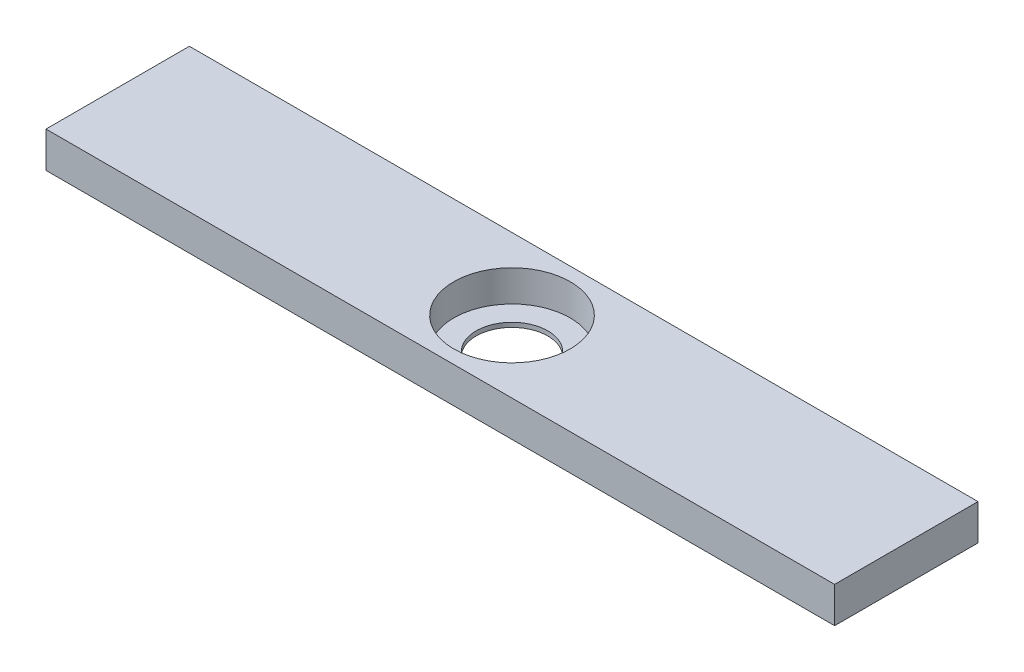
ISO-10303-21;
HEADER;
FILE_DESCRIPTION(('STEP AP214'),'2;1');
FILE_NAME('part.step','',(''),(''),'','','');
FILE_SCHEMA(('AUTOMOTIVE_DESIGN { 1 0 10303 214 1 1 1 1 }'));
ENDSEC;
DATA;
#1=APPLICATION_CONTEXT('core data for automotive mechanical design processes');
#2=APPLICATION_PROTOCOL_DEFINITION('international standard','automotive_design',2000,#1);
#3=PRODUCT_CONTEXT('',#1,'mechanical');
#4=PRODUCT('Part','Part','',(#3));
#5=PRODUCT_RELATED_PRODUCT_CATEGORY('part','',(#4));
#6=PRODUCT_DEFINITION_FORMATION('','',#4);
#7=PRODUCT_DEFINITION_CONTEXT('part definition',#1,'design');
#8=PRODUCT_DEFINITION('design','',#6,#7);
#9=PRODUCT_DEFINITION_SHAPE('','',#8);
#10=(LENGTH_UNIT() NAMED_UNIT(*) SI_UNIT(.MILLI.,.METRE.));
#11=(NAMED_UNIT(*) PLANE_ANGLE_UNIT() SI_UNIT($,.RADIAN.));
#12=(NAMED_UNIT(*) SI_UNIT($,.STERADIAN.) SOLID_ANGLE_UNIT());
#13=UNCERTAINTY_MEASURE_WITH_UNIT(LENGTH_MEASURE(1.E-05),#10,'distance_accuracy_value','');
#14=(GEOMETRIC_REPRESENTATION_CONTEXT(3) GLOBAL_UNCERTAINTY_ASSIGNED_CONTEXT((#13)) GLOBAL_UNIT_ASSIGNED_CONTEXT((#10,
#11,#12)) REPRESENTATION_CONTEXT('',''));
#15=CARTESIAN_POINT('',(0.,0.,0.));
#16=DIRECTION('',(0.,0.,1.));
#17=DIRECTION('',(1.,0.,0.));
#18=AXIS2_PLACEMENT_3D('',#15,#16,#17);
#19=CARTESIAN_POINT('',(139.7,12.7,-25.4));
#20=DIRECTION('',(-1.,0.,0.));
#21=DIRECTION('',(0.,0.,1.));
#22=AXIS2_PLACEMENT_3D('',#19,#20,#21);
#23=PLANE('',#22);
#24=DIRECTION('',(0.,0.,-1.));
#25=VECTOR('',#24,1.);
#26=CARTESIAN_POINT('',(139.7,0.,-25.4));
#27=LINE('',#26,#25);
#28=CARTESIAN_POINT('',(139.7,0.,25.4));
#29=VERTEX_POINT('',#28);
#30=CARTESIAN_POINT('',(139.7,0.,-25.4));
#31=VERTEX_POINT('',#30);
#32=EDGE_CURVE('E94',#29,#31,#27,.T.);
#33=ORIENTED_EDGE('',*,*,#32,.T.);
#34=DIRECTION('',(0.,-1.,0.));
#35=VECTOR('',#34,1.);
#36=CARTESIAN_POINT('',(139.7,12.7,-25.4));
#37=LINE('',#36,#35);
#38=CARTESIAN_POINT('',(139.7,12.7,-25.4));
#39=VERTEX_POINT('',#38);
#40=EDGE_CURVE('E11',#39,#31,#37,.T.);
#41=ORIENTED_EDGE('',*,*,#40,.F.);
#42=DIRECTION('',(0.,0.,-1.));
#43=VECTOR('',#42,1.);
#44=CARTESIAN_POINT('',(139.7,12.7,-25.4));
#45=LINE('',#44,#43);
#46=CARTESIAN_POINT('',(139.7,12.7,25.4));
#47=VERTEX_POINT('',#46);
#48=EDGE_CURVE('E82',#47,#39,#45,.T.);
#49=ORIENTED_EDGE('',*,*,#48,.F.);
#50=DIRECTION('',(0.,-1.,0.));
#51=VECTOR('',#50,1.);
#52=CARTESIAN_POINT('',(139.7,12.7,25.4));
#53=LINE('',#52,#51);
#54=EDGE_CURVE('E90',#47,#29,#53,.T.);
#55=ORIENTED_EDGE('',*,*,#54,.T.);
#56=EDGE_LOOP('',(#33,#41,#49,#55));
#57=FACE_BOUND('',#56,.T.);
#58=ADVANCED_FACE('F31',(#57),#23,.F.);
#59=CARTESIAN_POINT('',(-139.7,12.7,-25.4));
#60=DIRECTION('',(0.,0.,1.));
#61=DIRECTION('',(1.,0.,0.));
#62=AXIS2_PLACEMENT_3D('',#59,#60,#61);
#63=PLANE('',#62);
#64=DIRECTION('',(-1.,0.,0.));
#65=VECTOR('',#64,1.);
#66=CARTESIAN_POINT('',(-139.7,0.,-25.4));
#67=LINE('',#66,#65);
#68=CARTESIAN_POINT('',(-139.7,0.,-25.4));
#69=VERTEX_POINT('',#68);
#70=EDGE_CURVE('E86',#31,#69,#67,.T.);
#71=ORIENTED_EDGE('',*,*,#70,.T.);
#72=DIRECTION('',(0.,-1.,0.));
#73=VECTOR('',#72,1.);
#74=CARTESIAN_POINT('',(-139.7,12.7,-25.4));
#75=LINE('',#74,#73);
#76=CARTESIAN_POINT('',(-139.7,12.7,-25.4));
#77=VERTEX_POINT('',#76);
#78=EDGE_CURVE('E39',#77,#69,#75,.T.);
#79=ORIENTED_EDGE('',*,*,#78,.F.);
#80=DIRECTION('',(-1.,0.,0.));
#81=VECTOR('',#80,1.);
#82=CARTESIAN_POINT('',(-139.7,12.7,-25.4));
#83=LINE('',#82,#81);
#84=EDGE_CURVE('E77',#39,#77,#83,.T.);
#85=ORIENTED_EDGE('',*,*,#84,.F.);
#86=ORIENTED_EDGE('',*,*,#40,.T.);
#87=EDGE_LOOP('',(#71,#79,#85,#86));
#88=FACE_BOUND('',#87,.T.);
#89=ADVANCED_FACE('F85',(#88),#63,.F.);
#90=CARTESIAN_POINT('',(-139.7,12.7,-25.4));
#91=DIRECTION('',(1.,0.,0.));
#92=DIRECTION('',(0.,0.,-1.));
#93=AXIS2_PLACEMENT_3D('',#90,#91,#92);
#94=PLANE('',#93);
#95=DIRECTION('',(0.,0.,1.));
#96=VECTOR('',#95,1.);
#97=CARTESIAN_POINT('',(-139.7,0.,-25.4));
#98=LINE('',#97,#96);
#99=CARTESIAN_POINT('',(-139.7,0.,25.4));
#100=VERTEX_POINT('',#99);
#101=EDGE_CURVE('E64',#69,#100,#98,.T.);
#102=ORIENTED_EDGE('',*,*,#101,.T.);
#103=DIRECTION('',(0.,-1.,0.));
#104=VECTOR('',#103,1.);
#105=CARTESIAN_POINT('',(-139.7,12.7,25.4));
#106=LINE('',#105,#104);
#107=CARTESIAN_POINT('',(-139.7,12.7,25.4));
#108=VERTEX_POINT('',#107);
#109=EDGE_CURVE('E87',#108,#100,#106,.T.);
#110=ORIENTED_EDGE('',*,*,#109,.F.);
#111=DIRECTION('',(0.,0.,1.));
#112=VECTOR('',#111,1.);
#113=CARTESIAN_POINT('',(-139.7,12.7,-25.4));
#114=LINE('',#113,#112);
#115=EDGE_CURVE('E80',#77,#108,#114,.T.);
#116=ORIENTED_EDGE('',*,*,#115,.F.);
#117=ORIENTED_EDGE('',*,*,#78,.T.);
#118=EDGE_LOOP('',(#102,#110,#116,#117));
#119=FACE_BOUND('',#118,.T.);
#120=ADVANCED_FACE('F88',(#119),#94,.F.);
#121=CARTESIAN_POINT('',(-139.7,12.7,25.4));
#122=DIRECTION('',(0.,0.,-1.));
#123=DIRECTION('',(-1.,0.,0.));
#124=AXIS2_PLACEMENT_3D('',#121,#122,#123);
#125=PLANE('',#124);
#126=DIRECTION('',(1.,0.,0.));
#127=VECTOR('',#126,1.);
#128=CARTESIAN_POINT('',(-139.7,0.,25.4));
#129=LINE('',#128,#127);
#130=EDGE_CURVE('E70',#100,#29,#129,.T.);
#131=ORIENTED_EDGE('',*,*,#130,.T.);
#132=ORIENTED_EDGE('',*,*,#54,.F.);
#133=DIRECTION('',(1.,0.,0.));
#134=VECTOR('',#133,1.);
#135=CARTESIAN_POINT('',(-139.7,12.7,25.4));
#136=LINE('',#135,#134);
#137=EDGE_CURVE('E47',#108,#47,#136,.T.);
#138=ORIENTED_EDGE('',*,*,#137,.F.);
#139=ORIENTED_EDGE('',*,*,#109,.T.);
#140=EDGE_LOOP('',(#131,#132,#138,#139));
#141=FACE_BOUND('',#140,.T.);
#142=ADVANCED_FACE('F102',(#141),#125,.F.);
#143=CARTESIAN_POINT('',(139.7,12.7,25.4));
#144=DIRECTION('',(0.,1.,0.));
#145=DIRECTION('',(0.,0.,1.));
#146=AXIS2_PLACEMENT_3D('',#143,#144,#145);
#147=PLANE('',#146);
#148=CARTESIAN_POINT('',(0.,12.7,0.));
#149=DIRECTION('',(0.,1.,0.));
#150=DIRECTION('',(0.,0.,1.));
#151=AXIS2_PLACEMENT_3D('',#148,#149,#150);
#152=CIRCLE('',#151,20.6375);
#153=CARTESIAN_POINT('',(0.,12.7,20.6375));
#154=VERTEX_POINT('',#153);
#155=EDGE_CURVE('E108',#154,#154,#152,.T.);
#156=ORIENTED_EDGE('',*,*,#155,.F.);
#157=EDGE_LOOP('',(#156));
#158=FACE_BOUND('',#157,.T.);
#159=ORIENTED_EDGE('',*,*,#48,.T.);
#160=ORIENTED_EDGE('',*,*,#84,.T.);
#161=ORIENTED_EDGE('',*,*,#115,.T.);
#162=ORIENTED_EDGE('',*,*,#137,.T.);
#163=EDGE_LOOP('',(#159,#160,#161,#162));
#164=FACE_BOUND('',#163,.T.);
#165=ADVANCED_FACE('F78',(#158,#164),#147,.T.);
#166=CARTESIAN_POINT('',(139.7,0.,25.4));
#167=DIRECTION('',(0.,1.,0.));
#168=DIRECTION('',(0.,0.,1.));
#169=AXIS2_PLACEMENT_3D('',#166,#167,#168);
#170=PLANE('',#169);
#171=CARTESIAN_POINT('',(0.,0.,0.));
#172=DIRECTION('',(0.,1.,0.));
#173=DIRECTION('',(0.,0.,1.));
#174=AXIS2_PLACEMENT_3D('',#171,#172,#173);
#175=CIRCLE('',#174,12.7);
#176=CARTESIAN_POINT('',(0.,0.,12.7));
#177=VERTEX_POINT('',#176);
#178=EDGE_CURVE('E111',#177,#177,#175,.T.);
#179=ORIENTED_EDGE('',*,*,#178,.T.);
#180=EDGE_LOOP('',(#179));
#181=FACE_BOUND('',#180,.T.);
#182=ORIENTED_EDGE('',*,*,#32,.F.);
#183=ORIENTED_EDGE('',*,*,#130,.F.);
#184=ORIENTED_EDGE('',*,*,#101,.F.);
#185=ORIENTED_EDGE('',*,*,#70,.F.);
#186=EDGE_LOOP('',(#182,#183,#184,#185));
#187=FACE_BOUND('',#186,.T.);
#188=ADVANCED_FACE('F105',(#181,#187),#170,.F.);
#189=CARTESIAN_POINT('',(0.,1.5875,0.));
#190=DIRECTION('',(0.,1.,0.));
#191=DIRECTION('',(0.,0.,1.));
#192=AXIS2_PLACEMENT_3D('',#189,#190,#191);
#193=CYLINDRICAL_SURFACE('',#192,20.6375);
#194=CARTESIAN_POINT('',(0.,1.5875,0.));
#195=DIRECTION('',(0.,1.,0.));
#196=DIRECTION('',(0.,0.,1.));
#197=AXIS2_PLACEMENT_3D('',#194,#195,#196);
#198=CIRCLE('',#197,20.6375);
#199=CARTESIAN_POINT('',(0.,1.5875,20.6375));
#200=VERTEX_POINT('',#199);
#201=EDGE_CURVE('E97',#200,#200,#198,.T.);
#202=ORIENTED_EDGE('',*,*,#201,.F.);
#203=EDGE_LOOP('',(#202));
#204=FACE_BOUND('',#203,.T.);
#205=ORIENTED_EDGE('',*,*,#155,.T.);
#206=EDGE_LOOP('',(#205));
#207=FACE_BOUND('',#206,.T.);
#208=ADVANCED_FACE('F130',(#204,#207),#193,.F.);
#209=CARTESIAN_POINT('',(0.,1.5875,0.));
#210=DIRECTION('',(0.,1.,0.));
#211=DIRECTION('',(0.,0.,1.));
#212=AXIS2_PLACEMENT_3D('',#209,#210,#211);
#213=PLANE('',#212);
#214=CARTESIAN_POINT('',(0.,1.5875,0.));
#215=DIRECTION('',(0.,1.,0.));
#216=DIRECTION('',(0.,0.,1.));
#217=AXIS2_PLACEMENT_3D('',#214,#215,#216);
#218=CIRCLE('',#217,12.7);
#219=CARTESIAN_POINT('',(0.,1.5875,12.7));
#220=VERTEX_POINT('',#219);
#221=EDGE_CURVE('E114',#220,#220,#218,.T.);
#222=ORIENTED_EDGE('',*,*,#221,.F.);
#223=EDGE_LOOP('',(#222));
#224=FACE_BOUND('',#223,.T.);
#225=ORIENTED_EDGE('',*,*,#201,.T.);
#226=EDGE_LOOP('',(#225));
#227=FACE_BOUND('',#226,.T.);
#228=ADVANCED_FACE('F124',(#224,#227),#213,.T.);
#229=CARTESIAN_POINT('',(0.,0.,0.));
#230=DIRECTION('',(0.,1.,0.));
#231=DIRECTION('',(0.,0.,1.));
#232=AXIS2_PLACEMENT_3D('',#229,#230,#231);
#233=CYLINDRICAL_SURFACE('',#232,12.7);
#234=ORIENTED_EDGE('',*,*,#178,.F.);
#235=EDGE_LOOP('',(#234));
#236=FACE_BOUND('',#235,.T.);
#237=ORIENTED_EDGE('',*,*,#221,.T.);
#238=EDGE_LOOP('',(#237));
#239=FACE_BOUND('',#238,.T.);
#240=ADVANCED_FACE('F121',(#236,#239),#233,.F.);
#241=CLOSED_SHELL('',(#58,#89,#120,#142,#165,#188,#208,#228,#240));
#242=MANIFOLD_SOLID_BREP('B2',#241);
#243=ADVANCED_BREP_SHAPE_REPRESENTATION('',(#18,#242),#14);
#244=SHAPE_DEFINITION_REPRESENTATION(#9,#243);
ENDSEC;
END-ISO-10303-21;
